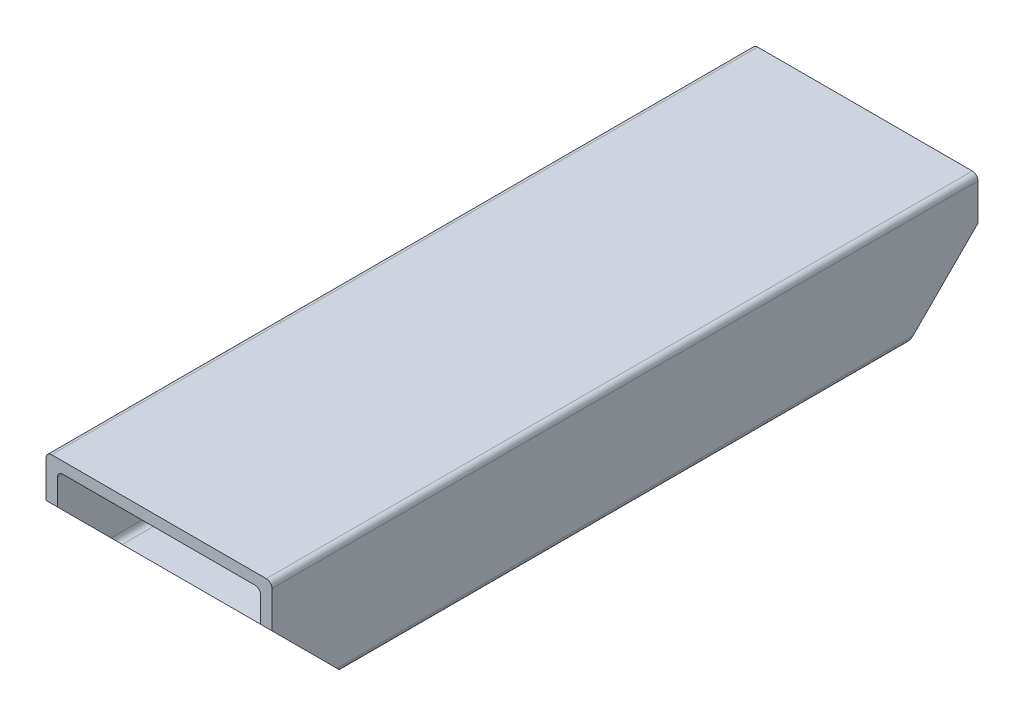
ISO-10303-21;
HEADER;
FILE_DESCRIPTION(('STEP AP214'),'2;1');
FILE_NAME('part.step','',(''),(''),'','','');
FILE_SCHEMA(('AUTOMOTIVE_DESIGN { 1 0 10303 214 1 1 1 1 }'));
ENDSEC;
DATA;
#1=APPLICATION_CONTEXT('core data for automotive mechanical design processes');
#2=APPLICATION_PROTOCOL_DEFINITION('international standard','automotive_design',2000,#1);
#3=PRODUCT_CONTEXT('',#1,'mechanical');
#4=PRODUCT('Part','Part','',(#3));
#5=PRODUCT_RELATED_PRODUCT_CATEGORY('part','',(#4));
#6=PRODUCT_DEFINITION_FORMATION('','',#4);
#7=PRODUCT_DEFINITION_CONTEXT('part definition',#1,'design');
#8=PRODUCT_DEFINITION('design','',#6,#7);
#9=PRODUCT_DEFINITION_SHAPE('','',#8);
#10=(LENGTH_UNIT() NAMED_UNIT(*) SI_UNIT(.MILLI.,.METRE.));
#11=(NAMED_UNIT(*) PLANE_ANGLE_UNIT() SI_UNIT($,.RADIAN.));
#12=(NAMED_UNIT(*) SI_UNIT($,.STERADIAN.) SOLID_ANGLE_UNIT());
#13=UNCERTAINTY_MEASURE_WITH_UNIT(LENGTH_MEASURE(1.E-05),#10,'distance_accuracy_value','');
#14=(GEOMETRIC_REPRESENTATION_CONTEXT(3) GLOBAL_UNCERTAINTY_ASSIGNED_CONTEXT((#13)) GLOBAL_UNIT_ASSIGNED_CONTEXT((#10,
#11,#12)) REPRESENTATION_CONTEXT('',''));
#15=CARTESIAN_POINT('',(0.,0.,0.));
#16=DIRECTION('',(0.,0.,1.));
#17=DIRECTION('',(1.,0.,0.));
#18=AXIS2_PLACEMENT_3D('',#15,#16,#17);
#19=CARTESIAN_POINT('',(2.,2.,250.));
#20=DIRECTION('',(0.,0.,-1.));
#21=DIRECTION('',(-1.,0.,0.));
#22=AXIS2_PLACEMENT_3D('',#19,#20,#21);
#23=PLANE('',#22);
#24=DIRECTION('',(0.,-1.,0.));
#25=VECTOR('',#24,1.);
#26=CARTESIAN_POINT('',(0.,2.00000000000001,250.));
#27=LINE('',#26,#25);
#28=CARTESIAN_POINT('',(0.,38.,250.));
#29=VERTEX_POINT('',#28);
#30=CARTESIAN_POINT('',(0.,25.,250.));
#31=VERTEX_POINT('',#30);
#32=EDGE_CURVE('E188',#29,#31,#27,.T.);
#33=ORIENTED_EDGE('',*,*,#32,.T.);
#34=DIRECTION('',(1.,0.,0.));
#35=VECTOR('',#34,1.);
#36=CARTESIAN_POINT('',(0.,25.,250.));
#37=LINE('',#36,#35);
#38=CARTESIAN_POINT('',(4.,25.,250.));
#39=VERTEX_POINT('',#38);
#40=EDGE_CURVE('E169',#31,#39,#37,.T.);
#41=ORIENTED_EDGE('',*,*,#40,.T.);
#42=DIRECTION('',(0.,-1.,0.));
#43=VECTOR('',#42,1.);
#44=CARTESIAN_POINT('',(4.,6.00000000000001,250.));
#45=LINE('',#44,#43);
#46=CARTESIAN_POINT('',(4.,34.,250.));
#47=VERTEX_POINT('',#46);
#48=EDGE_CURVE('E271',#47,#39,#45,.T.);
#49=ORIENTED_EDGE('',*,*,#48,.F.);
#50=CARTESIAN_POINT('',(6.,34.,250.));
#51=DIRECTION('',(0.,0.,1.));
#52=DIRECTION('',(1.,0.,0.));
#53=AXIS2_PLACEMENT_3D('',#50,#51,#52);
#54=CIRCLE('',#53,2.);
#55=CARTESIAN_POINT('',(6.00000000000001,36.,250.));
#56=VERTEX_POINT('',#55);
#57=EDGE_CURVE('E269',#56,#47,#54,.T.);
#58=ORIENTED_EDGE('',*,*,#57,.F.);
#59=DIRECTION('',(-1.,0.,0.));
#60=VECTOR('',#59,1.);
#61=CARTESIAN_POINT('',(6.00000000000001,36.,250.));
#62=LINE('',#61,#60);
#63=CARTESIAN_POINT('',(74.,36.,250.));
#64=VERTEX_POINT('',#63);
#65=EDGE_CURVE('E267',#64,#56,#62,.T.);
#66=ORIENTED_EDGE('',*,*,#65,.F.);
#67=CARTESIAN_POINT('',(74.,34.,250.));
#68=DIRECTION('',(0.,0.,1.));
#69=DIRECTION('',(1.,0.,0.));
#70=AXIS2_PLACEMENT_3D('',#67,#68,#69);
#71=CIRCLE('',#70,2.);
#72=CARTESIAN_POINT('',(76.,34.,250.));
#73=VERTEX_POINT('',#72);
#74=EDGE_CURVE('E264',#73,#64,#71,.T.);
#75=ORIENTED_EDGE('',*,*,#74,.F.);
#76=DIRECTION('',(0.,1.,0.));
#77=VECTOR('',#76,1.);
#78=CARTESIAN_POINT('',(76.,6.,250.));
#79=LINE('',#78,#77);
#80=CARTESIAN_POINT('',(76.,25.,250.));
#81=VERTEX_POINT('',#80);
#82=EDGE_CURVE('E262',#81,#73,#79,.T.);
#83=ORIENTED_EDGE('',*,*,#82,.F.);
#84=CARTESIAN_POINT('',(80.,25.,250.));
#85=VERTEX_POINT('',#84);
#86=EDGE_CURVE('E181',#81,#85,#37,.T.);
#87=ORIENTED_EDGE('',*,*,#86,.T.);
#88=DIRECTION('',(0.,1.,0.));
#89=VECTOR('',#88,1.);
#90=CARTESIAN_POINT('',(80.,2.,250.));
#91=LINE('',#90,#89);
#92=CARTESIAN_POINT('',(80.,38.,250.));
#93=VERTEX_POINT('',#92);
#94=EDGE_CURVE('E215',#85,#93,#91,.T.);
#95=ORIENTED_EDGE('',*,*,#94,.T.);
#96=CARTESIAN_POINT('',(78.,38.,250.));
#97=DIRECTION('',(0.,0.,1.));
#98=DIRECTION('',(-1.,0.,0.));
#99=AXIS2_PLACEMENT_3D('',#96,#97,#98);
#100=CIRCLE('',#99,2.);
#101=CARTESIAN_POINT('',(78.,40.,250.));
#102=VERTEX_POINT('',#101);
#103=EDGE_CURVE('E300',#93,#102,#100,.T.);
#104=ORIENTED_EDGE('',*,*,#103,.T.);
#105=DIRECTION('',(-1.,0.,0.));
#106=VECTOR('',#105,1.);
#107=CARTESIAN_POINT('',(2.00000000000001,40.,250.));
#108=LINE('',#107,#106);
#109=CARTESIAN_POINT('',(2.00000000000001,40.,250.));
#110=VERTEX_POINT('',#109);
#111=EDGE_CURVE('E200',#102,#110,#108,.T.);
#112=ORIENTED_EDGE('',*,*,#111,.T.);
#113=CARTESIAN_POINT('',(2.,38.,250.));
#114=DIRECTION('',(0.,0.,1.));
#115=DIRECTION('',(-1.,0.,0.));
#116=AXIS2_PLACEMENT_3D('',#113,#114,#115);
#117=CIRCLE('',#116,2.);
#118=EDGE_CURVE('E195',#110,#29,#117,.T.);
#119=ORIENTED_EDGE('',*,*,#118,.T.);
#120=EDGE_LOOP('',(#33,#41,#49,#58,#66,#75,#83,#87,#95,#104,#112,#119));
#121=FACE_BOUND('',#120,.T.);
#122=ADVANCED_FACE('F33',(#121),#23,.F.);
#123=CARTESIAN_POINT('',(2.,2.,0.));
#124=DIRECTION('',(0.,0.,-1.));
#125=DIRECTION('',(-1.,0.,0.));
#126=AXIS2_PLACEMENT_3D('',#123,#124,#125);
#127=PLANE('',#126);
#128=DIRECTION('',(1.,0.,0.));
#129=VECTOR('',#128,1.);
#130=CARTESIAN_POINT('',(0.,25.,0.));
#131=LINE('',#130,#129);
#132=CARTESIAN_POINT('',(0.,25.,0.));
#133=VERTEX_POINT('',#132);
#134=CARTESIAN_POINT('',(4.,25.,0.));
#135=VERTEX_POINT('',#134);
#136=EDGE_CURVE('E315',#133,#135,#131,.T.);
#137=ORIENTED_EDGE('',*,*,#136,.F.);
#138=DIRECTION('',(0.,-1.,0.));
#139=VECTOR('',#138,1.);
#140=CARTESIAN_POINT('',(0.,2.00000000000001,0.));
#141=LINE('',#140,#139);
#142=CARTESIAN_POINT('',(0.,38.,0.));
#143=VERTEX_POINT('',#142);
#144=EDGE_CURVE('E213',#143,#133,#141,.T.);
#145=ORIENTED_EDGE('',*,*,#144,.F.);
#146=CARTESIAN_POINT('',(2.,38.,0.));
#147=DIRECTION('',(0.,0.,1.));
#148=DIRECTION('',(-1.,0.,0.));
#149=AXIS2_PLACEMENT_3D('',#146,#147,#148);
#150=CIRCLE('',#149,2.);
#151=CARTESIAN_POINT('',(2.00000000000001,40.,0.));
#152=VERTEX_POINT('',#151);
#153=EDGE_CURVE('E211',#152,#143,#150,.T.);
#154=ORIENTED_EDGE('',*,*,#153,.F.);
#155=DIRECTION('',(-1.,0.,0.));
#156=VECTOR('',#155,1.);
#157=CARTESIAN_POINT('',(2.00000000000001,40.,0.));
#158=LINE('',#157,#156);
#159=CARTESIAN_POINT('',(78.,40.,0.));
#160=VERTEX_POINT('',#159);
#161=EDGE_CURVE('E209',#160,#152,#158,.T.);
#162=ORIENTED_EDGE('',*,*,#161,.F.);
#163=CARTESIAN_POINT('',(78.,38.,0.));
#164=DIRECTION('',(0.,0.,1.));
#165=DIRECTION('',(-1.,0.,0.));
#166=AXIS2_PLACEMENT_3D('',#163,#164,#165);
#167=CIRCLE('',#166,2.);
#168=CARTESIAN_POINT('',(80.,38.,0.));
#169=VERTEX_POINT('',#168);
#170=EDGE_CURVE('E206',#169,#160,#167,.T.);
#171=ORIENTED_EDGE('',*,*,#170,.F.);
#172=DIRECTION('',(0.,1.,0.));
#173=VECTOR('',#172,1.);
#174=CARTESIAN_POINT('',(80.,2.,0.));
#175=LINE('',#174,#173);
#176=CARTESIAN_POINT('',(80.,25.,0.));
#177=VERTEX_POINT('',#176);
#178=EDGE_CURVE('E204',#177,#169,#175,.T.);
#179=ORIENTED_EDGE('',*,*,#178,.F.);
#180=CARTESIAN_POINT('',(76.,25.,0.));
#181=VERTEX_POINT('',#180);
#182=EDGE_CURVE('E319',#181,#177,#131,.T.);
#183=ORIENTED_EDGE('',*,*,#182,.F.);
#184=DIRECTION('',(0.,1.,0.));
#185=VECTOR('',#184,1.);
#186=CARTESIAN_POINT('',(76.,6.,0.));
#187=LINE('',#186,#185);
#188=CARTESIAN_POINT('',(76.,34.,0.));
#189=VERTEX_POINT('',#188);
#190=EDGE_CURVE('E261',#181,#189,#187,.T.);
#191=ORIENTED_EDGE('',*,*,#190,.T.);
#192=CARTESIAN_POINT('',(74.,34.,0.));
#193=DIRECTION('',(0.,0.,1.));
#194=DIRECTION('',(1.,0.,0.));
#195=AXIS2_PLACEMENT_3D('',#192,#193,#194);
#196=CIRCLE('',#195,2.);
#197=CARTESIAN_POINT('',(74.,36.,0.));
#198=VERTEX_POINT('',#197);
#199=EDGE_CURVE('E274',#189,#198,#196,.T.);
#200=ORIENTED_EDGE('',*,*,#199,.T.);
#201=DIRECTION('',(-1.,0.,0.));
#202=VECTOR('',#201,1.);
#203=CARTESIAN_POINT('',(6.00000000000001,36.,0.));
#204=LINE('',#203,#202);
#205=CARTESIAN_POINT('',(6.00000000000001,36.,0.));
#206=VERTEX_POINT('',#205);
#207=EDGE_CURVE('E277',#198,#206,#204,.T.);
#208=ORIENTED_EDGE('',*,*,#207,.T.);
#209=CARTESIAN_POINT('',(6.,34.,0.));
#210=DIRECTION('',(0.,0.,1.));
#211=DIRECTION('',(1.,0.,0.));
#212=AXIS2_PLACEMENT_3D('',#209,#210,#211);
#213=CIRCLE('',#212,2.);
#214=CARTESIAN_POINT('',(4.,34.,0.));
#215=VERTEX_POINT('',#214);
#216=EDGE_CURVE('E280',#206,#215,#213,.T.);
#217=ORIENTED_EDGE('',*,*,#216,.T.);
#218=DIRECTION('',(0.,-1.,0.));
#219=VECTOR('',#218,1.);
#220=CARTESIAN_POINT('',(4.,6.00000000000001,0.));
#221=LINE('',#220,#219);
#222=EDGE_CURVE('E265',#215,#135,#221,.T.);
#223=ORIENTED_EDGE('',*,*,#222,.T.);
#224=EDGE_LOOP('',(#137,#145,#154,#162,#171,#179,#183,#191,#200,#208,#217,#223));
#225=FACE_BOUND('',#224,.T.);
#226=ADVANCED_FACE('F314',(#225),#127,.T.);
#227=CARTESIAN_POINT('',(2.,2.,250.));
#228=DIRECTION('',(0.,0.,-1.));
#229=DIRECTION('',(-1.,0.,0.));
#230=AXIS2_PLACEMENT_3D('',#227,#228,#229);
#231=CYLINDRICAL_SURFACE('',#230,2.);
#232=DIRECTION('',(0.,0.,-1.));
#233=VECTOR('',#232,1.);
#234=CARTESIAN_POINT('',(2.00000000000001,0.,250.));
#235=LINE('',#234,#233);
#236=CARTESIAN_POINT('',(2.00000000000001,0.,225.));
#237=VERTEX_POINT('',#236);
#238=CARTESIAN_POINT('',(2.00000000000001,0.,25.0000000000003));
#239=VERTEX_POINT('',#238);
#240=EDGE_CURVE('E231',#237,#239,#235,.T.);
#241=ORIENTED_EDGE('',*,*,#240,.F.);
#242=CARTESIAN_POINT('',(2.,2.,227.));
#243=DIRECTION('',(0.,0.707106781186551,-0.707106781186544));
#244=DIRECTION('',(0.,-0.707106781186544,-0.707106781186551));
#245=AXIS2_PLACEMENT_3D('',#242,#243,#244);
#246=ELLIPSE('',#245,2.82842712474621,2.);
#247=CARTESIAN_POINT('',(0.,2.00000000000002,227.));
#248=VERTEX_POINT('',#247);
#249=EDGE_CURVE('E328',#237,#248,#246,.T.);
#250=ORIENTED_EDGE('',*,*,#249,.T.);
#251=DIRECTION('',(0.,0.,-1.));
#252=VECTOR('',#251,1.);
#253=CARTESIAN_POINT('',(0.,2.00000000000001,250.));
#254=LINE('',#253,#252);
#255=CARTESIAN_POINT('',(0.,1.99999999999999,23.0000000000003));
#256=VERTEX_POINT('',#255);
#257=EDGE_CURVE('E190',#248,#256,#254,.T.);
#258=ORIENTED_EDGE('',*,*,#257,.T.);
#259=CARTESIAN_POINT('',(2.,2.,23.0000000000003));
#260=DIRECTION('',(0.,0.707106781186551,0.707106781186544));
#261=DIRECTION('',(0.,0.707106781186544,-0.707106781186551));
#262=AXIS2_PLACEMENT_3D('',#259,#260,#261);
#263=ELLIPSE('',#262,2.82842712474621,2.);
#264=EDGE_CURVE('E258',#256,#239,#263,.T.);
#265=ORIENTED_EDGE('',*,*,#264,.T.);
#266=EDGE_LOOP('',(#241,#250,#258,#265));
#267=FACE_BOUND('',#266,.T.);
#268=ADVANCED_FACE('F35',(#267),#231,.T.);
#269=CARTESIAN_POINT('',(2.00000000000001,0.,250.));
#270=DIRECTION('',(0.,1.,0.));
#271=DIRECTION('',(0.,0.,1.));
#272=AXIS2_PLACEMENT_3D('',#269,#270,#271);
#273=PLANE('',#272);
#274=DIRECTION('',(0.,0.,-1.));
#275=VECTOR('',#274,1.);
#276=CARTESIAN_POINT('',(78.,0.,250.));
#277=LINE('',#276,#275);
#278=CARTESIAN_POINT('',(78.,0.,225.));
#279=VERTEX_POINT('',#278);
#280=CARTESIAN_POINT('',(78.,0.,25.0000000000003));
#281=VERTEX_POINT('',#280);
#282=EDGE_CURVE('E229',#279,#281,#277,.T.);
#283=ORIENTED_EDGE('',*,*,#282,.F.);
#284=DIRECTION('',(1.,0.,0.));
#285=VECTOR('',#284,1.);
#286=CARTESIAN_POINT('',(0.,0.,225.));
#287=LINE('',#286,#285);
#288=EDGE_CURVE('E191',#237,#279,#287,.T.);
#289=ORIENTED_EDGE('',*,*,#288,.F.);
#290=ORIENTED_EDGE('',*,*,#240,.T.);
#291=DIRECTION('',(1.,0.,0.));
#292=VECTOR('',#291,1.);
#293=CARTESIAN_POINT('',(0.,0.,25.0000000000003));
#294=LINE('',#293,#292);
#295=EDGE_CURVE('E318',#239,#281,#294,.T.);
#296=ORIENTED_EDGE('',*,*,#295,.T.);
#297=EDGE_LOOP('',(#283,#289,#290,#296));
#298=FACE_BOUND('',#297,.T.);
#299=ADVANCED_FACE('F410',(#298),#273,.F.);
#300=CARTESIAN_POINT('',(78.,2.,250.));
#301=DIRECTION('',(0.,0.,-1.));
#302=DIRECTION('',(-1.,0.,0.));
#303=AXIS2_PLACEMENT_3D('',#300,#301,#302);
#304=CYLINDRICAL_SURFACE('',#303,2.);
#305=DIRECTION('',(0.,0.,-1.));
#306=VECTOR('',#305,1.);
#307=CARTESIAN_POINT('',(80.,2.,250.));
#308=LINE('',#307,#306);
#309=CARTESIAN_POINT('',(80.,2.00000000000001,227.));
#310=VERTEX_POINT('',#309);
#311=CARTESIAN_POINT('',(80.,1.99999999999999,23.0000000000003));
#312=VERTEX_POINT('',#311);
#313=EDGE_CURVE('E227',#310,#312,#308,.T.);
#314=ORIENTED_EDGE('',*,*,#313,.F.);
#315=CARTESIAN_POINT('',(78.,2.,227.));
#316=DIRECTION('',(0.,0.707106781186551,-0.707106781186544));
#317=DIRECTION('',(0.,-0.707106781186544,-0.707106781186551));
#318=AXIS2_PLACEMENT_3D('',#315,#316,#317);
#319=ELLIPSE('',#318,2.82842712474621,2.);
#320=EDGE_CURVE('E331',#310,#279,#319,.T.);
#321=ORIENTED_EDGE('',*,*,#320,.T.);
#322=ORIENTED_EDGE('',*,*,#282,.T.);
#323=CARTESIAN_POINT('',(78.,2.,23.0000000000003));
#324=DIRECTION('',(0.,0.707106781186551,0.707106781186544));
#325=DIRECTION('',(0.,0.707106781186544,-0.707106781186551));
#326=AXIS2_PLACEMENT_3D('',#323,#324,#325);
#327=ELLIPSE('',#326,2.82842712474621,2.);
#328=EDGE_CURVE('E251',#281,#312,#327,.T.);
#329=ORIENTED_EDGE('',*,*,#328,.T.);
#330=EDGE_LOOP('',(#314,#321,#322,#329));
#331=FACE_BOUND('',#330,.T.);
#332=ADVANCED_FACE('F408',(#331),#304,.T.);
#333=CARTESIAN_POINT('',(80.,2.,250.));
#334=DIRECTION('',(-1.,0.,0.));
#335=DIRECTION('',(0.,0.,1.));
#336=AXIS2_PLACEMENT_3D('',#333,#334,#335);
#337=PLANE('',#336);
#338=ORIENTED_EDGE('',*,*,#94,.F.);
#339=DIRECTION('',(0.,0.707106781186544,0.707106781186551));
#340=VECTOR('',#339,1.);
#341=CARTESIAN_POINT('',(80.,25.,250.));
#342=LINE('',#341,#340);
#343=EDGE_CURVE('E192',#310,#85,#342,.T.);
#344=ORIENTED_EDGE('',*,*,#343,.F.);
#345=ORIENTED_EDGE('',*,*,#313,.T.);
#346=DIRECTION('',(0.,-0.707106781186544,0.707106781186551));
#347=VECTOR('',#346,1.);
#348=CARTESIAN_POINT('',(80.,25.,0.));
#349=LINE('',#348,#347);
#350=EDGE_CURVE('E325',#177,#312,#349,.T.);
#351=ORIENTED_EDGE('',*,*,#350,.F.);
#352=ORIENTED_EDGE('',*,*,#178,.T.);
#353=DIRECTION('',(0.,0.,-1.));
#354=VECTOR('',#353,1.);
#355=CARTESIAN_POINT('',(80.,38.,250.));
#356=LINE('',#355,#354);
#357=EDGE_CURVE('E224',#93,#169,#356,.T.);
#358=ORIENTED_EDGE('',*,*,#357,.F.);
#359=EDGE_LOOP('',(#338,#344,#345,#351,#352,#358));
#360=FACE_BOUND('',#359,.T.);
#361=ADVANCED_FACE('F349',(#360),#337,.F.);
#362=CARTESIAN_POINT('',(78.,38.,250.));
#363=DIRECTION('',(0.,0.,-1.));
#364=DIRECTION('',(-1.,0.,0.));
#365=AXIS2_PLACEMENT_3D('',#362,#363,#364);
#366=CYLINDRICAL_SURFACE('',#365,2.);
#367=ORIENTED_EDGE('',*,*,#170,.T.);
#368=DIRECTION('',(0.,0.,-1.));
#369=VECTOR('',#368,1.);
#370=CARTESIAN_POINT('',(78.,40.,250.));
#371=LINE('',#370,#369);
#372=EDGE_CURVE('E221',#102,#160,#371,.T.);
#373=ORIENTED_EDGE('',*,*,#372,.F.);
#374=ORIENTED_EDGE('',*,*,#103,.F.);
#375=ORIENTED_EDGE('',*,*,#357,.T.);
#376=EDGE_LOOP('',(#367,#373,#374,#375));
#377=FACE_BOUND('',#376,.T.);
#378=ADVANCED_FACE('F354',(#377),#366,.T.);
#379=CARTESIAN_POINT('',(2.00000000000001,40.,250.));
#380=DIRECTION('',(0.,-1.,0.));
#381=DIRECTION('',(0.,0.,-1.));
#382=AXIS2_PLACEMENT_3D('',#379,#380,#381);
#383=PLANE('',#382);
#384=ORIENTED_EDGE('',*,*,#161,.T.);
#385=DIRECTION('',(0.,0.,-1.));
#386=VECTOR('',#385,1.);
#387=CARTESIAN_POINT('',(2.00000000000001,40.,250.));
#388=LINE('',#387,#386);
#389=EDGE_CURVE('E218',#110,#152,#388,.T.);
#390=ORIENTED_EDGE('',*,*,#389,.F.);
#391=ORIENTED_EDGE('',*,*,#111,.F.);
#392=ORIENTED_EDGE('',*,*,#372,.T.);
#393=EDGE_LOOP('',(#384,#390,#391,#392));
#394=FACE_BOUND('',#393,.T.);
#395=ADVANCED_FACE('F306',(#394),#383,.F.);
#396=CARTESIAN_POINT('',(2.,38.,250.));
#397=DIRECTION('',(0.,0.,-1.));
#398=DIRECTION('',(-1.,0.,0.));
#399=AXIS2_PLACEMENT_3D('',#396,#397,#398);
#400=CYLINDRICAL_SURFACE('',#399,2.);
#401=ORIENTED_EDGE('',*,*,#153,.T.);
#402=DIRECTION('',(0.,0.,-1.));
#403=VECTOR('',#402,1.);
#404=CARTESIAN_POINT('',(0.,38.,250.));
#405=LINE('',#404,#403);
#406=EDGE_CURVE('E198',#29,#143,#405,.T.);
#407=ORIENTED_EDGE('',*,*,#406,.F.);
#408=ORIENTED_EDGE('',*,*,#118,.F.);
#409=ORIENTED_EDGE('',*,*,#389,.T.);
#410=EDGE_LOOP('',(#401,#407,#408,#409));
#411=FACE_BOUND('',#410,.T.);
#412=ADVANCED_FACE('F310',(#411),#400,.T.);
#413=CARTESIAN_POINT('',(0.,2.00000000000001,250.));
#414=DIRECTION('',(1.,0.,0.));
#415=DIRECTION('',(0.,0.,-1.));
#416=AXIS2_PLACEMENT_3D('',#413,#414,#415);
#417=PLANE('',#416);
#418=ORIENTED_EDGE('',*,*,#257,.F.);
#419=DIRECTION('',(0.,0.707106781186544,0.707106781186551));
#420=VECTOR('',#419,1.);
#421=CARTESIAN_POINT('',(0.,25.,250.));
#422=LINE('',#421,#420);
#423=EDGE_CURVE('E172',#248,#31,#422,.T.);
#424=ORIENTED_EDGE('',*,*,#423,.T.);
#425=ORIENTED_EDGE('',*,*,#32,.F.);
#426=ORIENTED_EDGE('',*,*,#406,.T.);
#427=ORIENTED_EDGE('',*,*,#144,.T.);
#428=DIRECTION('',(0.,-0.707106781186544,0.707106781186551));
#429=VECTOR('',#428,1.);
#430=CARTESIAN_POINT('',(0.,25.,0.));
#431=LINE('',#430,#429);
#432=EDGE_CURVE('E323',#133,#256,#431,.T.);
#433=ORIENTED_EDGE('',*,*,#432,.T.);
#434=EDGE_LOOP('',(#418,#424,#425,#426,#427,#433));
#435=FACE_BOUND('',#434,.T.);
#436=ADVANCED_FACE('F186',(#435),#417,.F.);
#437=CARTESIAN_POINT('',(74.,6.,250.));
#438=DIRECTION('',(0.,0.,-1.));
#439=DIRECTION('',(-1.,0.,0.));
#440=AXIS2_PLACEMENT_3D('',#437,#438,#439);
#441=CYLINDRICAL_SURFACE('',#440,2.);
#442=CARTESIAN_POINT('',(74.,6.,231.));
#443=DIRECTION('',(0.,0.707106781186551,-0.707106781186544));
#444=DIRECTION('',(0.,-0.707106781186544,-0.707106781186551));
#445=AXIS2_PLACEMENT_3D('',#442,#443,#444);
#446=ELLIPSE('',#445,2.82842712474621,2.);
#447=CARTESIAN_POINT('',(76.,6.,231.));
#448=VERTEX_POINT('',#447);
#449=CARTESIAN_POINT('',(74.,4.,229.));
#450=VERTEX_POINT('',#449);
#451=EDGE_CURVE('E47',#448,#450,#446,.T.);
#452=ORIENTED_EDGE('',*,*,#451,.F.);
#453=DIRECTION('',(0.,0.,-1.));
#454=VECTOR('',#453,1.);
#455=CARTESIAN_POINT('',(76.,6.,250.));
#456=LINE('',#455,#454);
#457=CARTESIAN_POINT('',(76.,6.,19.0000000000002));
#458=VERTEX_POINT('',#457);
#459=EDGE_CURVE('E207',#448,#458,#456,.T.);
#460=ORIENTED_EDGE('',*,*,#459,.T.);
#461=CARTESIAN_POINT('',(74.,6.,19.0000000000002));
#462=DIRECTION('',(0.,0.707106781186551,0.707106781186544));
#463=DIRECTION('',(0.,0.707106781186544,-0.707106781186551));
#464=AXIS2_PLACEMENT_3D('',#461,#462,#463);
#465=ELLIPSE('',#464,2.82842712474621,2.);
#466=CARTESIAN_POINT('',(74.,4.,21.0000000000002));
#467=VERTEX_POINT('',#466);
#468=EDGE_CURVE('E238',#467,#458,#465,.T.);
#469=ORIENTED_EDGE('',*,*,#468,.F.);
#470=DIRECTION('',(0.,0.,-1.));
#471=VECTOR('',#470,1.);
#472=CARTESIAN_POINT('',(74.,4.,250.));
#473=LINE('',#472,#471);
#474=EDGE_CURVE('E246',#450,#467,#473,.T.);
#475=ORIENTED_EDGE('',*,*,#474,.F.);
#476=EDGE_LOOP('',(#452,#460,#469,#475));
#477=FACE_BOUND('',#476,.T.);
#478=ADVANCED_FACE('F245',(#477),#441,.F.);
#479=CARTESIAN_POINT('',(76.,6.,250.));
#480=DIRECTION('',(-1.,0.,0.));
#481=DIRECTION('',(0.,0.,1.));
#482=AXIS2_PLACEMENT_3D('',#479,#480,#481);
#483=PLANE('',#482);
#484=DIRECTION('',(0.,-0.707106781186544,-0.707106781186551));
#485=VECTOR('',#484,1.);
#486=CARTESIAN_POINT('',(76.,15.5000000000001,240.5));
#487=LINE('',#486,#485);
#488=EDGE_CURVE('E334',#81,#448,#487,.T.);
#489=ORIENTED_EDGE('',*,*,#488,.F.);
#490=ORIENTED_EDGE('',*,*,#82,.T.);
#491=DIRECTION('',(0.,0.,-1.));
#492=VECTOR('',#491,1.);
#493=CARTESIAN_POINT('',(76.,34.,250.));
#494=LINE('',#493,#492);
#495=EDGE_CURVE('E295',#73,#189,#494,.T.);
#496=ORIENTED_EDGE('',*,*,#495,.T.);
#497=ORIENTED_EDGE('',*,*,#190,.F.);
#498=DIRECTION('',(0.,0.707106781186544,-0.707106781186551));
#499=VECTOR('',#498,1.);
#500=CARTESIAN_POINT('',(76.,-109.5,134.500000000001));
#501=LINE('',#500,#499);
#502=EDGE_CURVE('E248',#458,#181,#501,.T.);
#503=ORIENTED_EDGE('',*,*,#502,.F.);
#504=ORIENTED_EDGE('',*,*,#459,.F.);
#505=EDGE_LOOP('',(#489,#490,#496,#497,#503,#504));
#506=FACE_BOUND('',#505,.T.);
#507=ADVANCED_FACE('F358',(#506),#483,.T.);
#508=CARTESIAN_POINT('',(74.,34.,250.));
#509=DIRECTION('',(0.,0.,-1.));
#510=DIRECTION('',(-1.,0.,0.));
#511=AXIS2_PLACEMENT_3D('',#508,#509,#510);
#512=CYLINDRICAL_SURFACE('',#511,2.);
#513=ORIENTED_EDGE('',*,*,#199,.F.);
#514=ORIENTED_EDGE('',*,*,#495,.F.);
#515=ORIENTED_EDGE('',*,*,#74,.T.);
#516=DIRECTION('',(0.,0.,-1.));
#517=VECTOR('',#516,1.);
#518=CARTESIAN_POINT('',(74.,36.,250.));
#519=LINE('',#518,#517);
#520=EDGE_CURVE('E293',#64,#198,#519,.T.);
#521=ORIENTED_EDGE('',*,*,#520,.T.);
#522=EDGE_LOOP('',(#513,#514,#515,#521));
#523=FACE_BOUND('',#522,.T.);
#524=ADVANCED_FACE('F362',(#523),#512,.F.);
#525=CARTESIAN_POINT('',(6.00000000000001,36.,250.));
#526=DIRECTION('',(0.,-1.,0.));
#527=DIRECTION('',(0.,0.,-1.));
#528=AXIS2_PLACEMENT_3D('',#525,#526,#527);
#529=PLANE('',#528);
#530=ORIENTED_EDGE('',*,*,#207,.F.);
#531=ORIENTED_EDGE('',*,*,#520,.F.);
#532=ORIENTED_EDGE('',*,*,#65,.T.);
#533=DIRECTION('',(0.,0.,-1.));
#534=VECTOR('',#533,1.);
#535=CARTESIAN_POINT('',(6.00000000000001,36.,250.));
#536=LINE('',#535,#534);
#537=EDGE_CURVE('E291',#56,#206,#536,.T.);
#538=ORIENTED_EDGE('',*,*,#537,.T.);
#539=EDGE_LOOP('',(#530,#531,#532,#538));
#540=FACE_BOUND('',#539,.T.);
#541=ADVANCED_FACE('F367',(#540),#529,.T.);
#542=CARTESIAN_POINT('',(6.,34.,250.));
#543=DIRECTION('',(0.,0.,-1.));
#544=DIRECTION('',(-1.,0.,0.));
#545=AXIS2_PLACEMENT_3D('',#542,#543,#544);
#546=CYLINDRICAL_SURFACE('',#545,2.);
#547=ORIENTED_EDGE('',*,*,#216,.F.);
#548=ORIENTED_EDGE('',*,*,#537,.F.);
#549=ORIENTED_EDGE('',*,*,#57,.T.);
#550=DIRECTION('',(0.,0.,-1.));
#551=VECTOR('',#550,1.);
#552=CARTESIAN_POINT('',(4.,34.,250.));
#553=LINE('',#552,#551);
#554=EDGE_CURVE('E289',#47,#215,#553,.T.);
#555=ORIENTED_EDGE('',*,*,#554,.T.);
#556=EDGE_LOOP('',(#547,#548,#549,#555));
#557=FACE_BOUND('',#556,.T.);
#558=ADVANCED_FACE('F372',(#557),#546,.F.);
#559=CARTESIAN_POINT('',(4.,6.00000000000001,250.));
#560=DIRECTION('',(1.,0.,0.));
#561=DIRECTION('',(0.,0.,-1.));
#562=AXIS2_PLACEMENT_3D('',#559,#560,#561);
#563=PLANE('',#562);
#564=DIRECTION('',(0.,0.707106781186544,0.707106781186551));
#565=VECTOR('',#564,1.);
#566=CARTESIAN_POINT('',(4.,15.5000000000001,240.5));
#567=LINE('',#566,#565);
#568=CARTESIAN_POINT('',(4.,6.00000000000001,231.));
#569=VERTEX_POINT('',#568);
#570=EDGE_CURVE('E175',#569,#39,#567,.T.);
#571=ORIENTED_EDGE('',*,*,#570,.F.);
#572=DIRECTION('',(0.,0.,-1.));
#573=VECTOR('',#572,1.);
#574=CARTESIAN_POINT('',(4.,6.00000000000001,250.));
#575=LINE('',#574,#573);
#576=CARTESIAN_POINT('',(4.,6.00000000000001,19.0000000000002));
#577=VERTEX_POINT('',#576);
#578=EDGE_CURVE('E287',#569,#577,#575,.T.);
#579=ORIENTED_EDGE('',*,*,#578,.T.);
#580=DIRECTION('',(0.,-0.707106781186544,0.707106781186551));
#581=VECTOR('',#580,1.);
#582=CARTESIAN_POINT('',(4.,-109.5,134.500000000001));
#583=LINE('',#582,#581);
#584=EDGE_CURVE('E249',#135,#577,#583,.T.);
#585=ORIENTED_EDGE('',*,*,#584,.F.);
#586=ORIENTED_EDGE('',*,*,#222,.F.);
#587=ORIENTED_EDGE('',*,*,#554,.F.);
#588=ORIENTED_EDGE('',*,*,#48,.T.);
#589=EDGE_LOOP('',(#571,#579,#585,#586,#587,#588));
#590=FACE_BOUND('',#589,.T.);
#591=ADVANCED_FACE('F375',(#590),#563,.T.);
#592=CARTESIAN_POINT('',(6.,6.,250.));
#593=DIRECTION('',(0.,0.,-1.));
#594=DIRECTION('',(-1.,0.,0.));
#595=AXIS2_PLACEMENT_3D('',#592,#593,#594);
#596=CYLINDRICAL_SURFACE('',#595,2.);
#597=CARTESIAN_POINT('',(6.,6.,231.));
#598=DIRECTION('',(0.,0.707106781186551,-0.707106781186544));
#599=DIRECTION('',(0.,-0.707106781186544,-0.707106781186551));
#600=AXIS2_PLACEMENT_3D('',#597,#598,#599);
#601=ELLIPSE('',#600,2.82842712474621,2.);
#602=CARTESIAN_POINT('',(6.00000000000001,4.,229.));
#603=VERTEX_POINT('',#602);
#604=EDGE_CURVE('E180',#603,#569,#601,.T.);
#605=ORIENTED_EDGE('',*,*,#604,.F.);
#606=DIRECTION('',(0.,0.,-1.));
#607=VECTOR('',#606,1.);
#608=CARTESIAN_POINT('',(6.00000000000001,4.,250.));
#609=LINE('',#608,#607);
#610=CARTESIAN_POINT('',(6.00000000000001,4.,21.0000000000002));
#611=VERTEX_POINT('',#610);
#612=EDGE_CURVE('E55',#603,#611,#609,.T.);
#613=ORIENTED_EDGE('',*,*,#612,.T.);
#614=CARTESIAN_POINT('',(6.,6.,19.0000000000002));
#615=DIRECTION('',(0.,0.707106781186551,0.707106781186544));
#616=DIRECTION('',(0.,0.707106781186544,-0.707106781186551));
#617=AXIS2_PLACEMENT_3D('',#614,#615,#616);
#618=ELLIPSE('',#617,2.82842712474621,2.);
#619=EDGE_CURVE('E241',#577,#611,#618,.T.);
#620=ORIENTED_EDGE('',*,*,#619,.F.);
#621=ORIENTED_EDGE('',*,*,#578,.F.);
#622=EDGE_LOOP('',(#605,#613,#620,#621));
#623=FACE_BOUND('',#622,.T.);
#624=ADVANCED_FACE('F377',(#623),#596,.F.);
#625=CARTESIAN_POINT('',(6.00000000000001,4.,250.));
#626=DIRECTION('',(0.,1.,0.));
#627=DIRECTION('',(0.,0.,1.));
#628=AXIS2_PLACEMENT_3D('',#625,#626,#627);
#629=PLANE('',#628);
#630=DIRECTION('',(-1.,0.,0.));
#631=VECTOR('',#630,1.);
#632=CARTESIAN_POINT('',(6.00000000000001,4.,229.));
#633=LINE('',#632,#631);
#634=EDGE_CURVE('E11',#450,#603,#633,.T.);
#635=ORIENTED_EDGE('',*,*,#634,.F.);
#636=ORIENTED_EDGE('',*,*,#474,.T.);
#637=DIRECTION('',(1.,0.,0.));
#638=VECTOR('',#637,1.);
#639=CARTESIAN_POINT('',(6.00000000000001,4.,21.0000000000002));
#640=LINE('',#639,#638);
#641=EDGE_CURVE('E41',#611,#467,#640,.T.);
#642=ORIENTED_EDGE('',*,*,#641,.F.);
#643=ORIENTED_EDGE('',*,*,#612,.F.);
#644=EDGE_LOOP('',(#635,#636,#642,#643));
#645=FACE_BOUND('',#644,.T.);
#646=ADVANCED_FACE('F378',(#645),#629,.T.);
#647=CARTESIAN_POINT('',(0.,25.,0.));
#648=DIRECTION('',(0.,0.707106781186551,0.707106781186544));
#649=DIRECTION('',(0.,-0.707106781186544,0.707106781186551));
#650=AXIS2_PLACEMENT_3D('',#647,#648,#649);
#651=PLANE('',#650);
#652=ORIENTED_EDGE('',*,*,#432,.F.);
#653=ORIENTED_EDGE('',*,*,#136,.T.);
#654=ORIENTED_EDGE('',*,*,#584,.T.);
#655=ORIENTED_EDGE('',*,*,#619,.T.);
#656=ORIENTED_EDGE('',*,*,#641,.T.);
#657=ORIENTED_EDGE('',*,*,#468,.T.);
#658=ORIENTED_EDGE('',*,*,#502,.T.);
#659=ORIENTED_EDGE('',*,*,#182,.T.);
#660=ORIENTED_EDGE('',*,*,#350,.T.);
#661=ORIENTED_EDGE('',*,*,#328,.F.);
#662=ORIENTED_EDGE('',*,*,#295,.F.);
#663=ORIENTED_EDGE('',*,*,#264,.F.);
#664=EDGE_LOOP('',(#652,#653,#654,#655,#656,#657,#658,#659,#660,#661,#662,#663));
#665=FACE_BOUND('',#664,.T.);
#666=ADVANCED_FACE('F237',(#665),#651,.F.);
#667=CARTESIAN_POINT('',(0.,25.,250.));
#668=DIRECTION('',(0.,0.707106781186551,-0.707106781186544));
#669=DIRECTION('',(0.,0.707106781186544,0.707106781186551));
#670=AXIS2_PLACEMENT_3D('',#667,#668,#669);
#671=PLANE('',#670);
#672=ORIENTED_EDGE('',*,*,#288,.T.);
#673=ORIENTED_EDGE('',*,*,#320,.F.);
#674=ORIENTED_EDGE('',*,*,#343,.T.);
#675=ORIENTED_EDGE('',*,*,#86,.F.);
#676=ORIENTED_EDGE('',*,*,#488,.T.);
#677=ORIENTED_EDGE('',*,*,#451,.T.);
#678=ORIENTED_EDGE('',*,*,#634,.T.);
#679=ORIENTED_EDGE('',*,*,#604,.T.);
#680=ORIENTED_EDGE('',*,*,#570,.T.);
#681=ORIENTED_EDGE('',*,*,#40,.F.);
#682=ORIENTED_EDGE('',*,*,#423,.F.);
#683=ORIENTED_EDGE('',*,*,#249,.F.);
#684=EDGE_LOOP('',(#672,#673,#674,#675,#676,#677,#678,#679,#680,#681,#682,#683));
#685=FACE_BOUND('',#684,.T.);
#686=ADVANCED_FACE('F171',(#685),#671,.F.);
#687=CLOSED_SHELL('',(#122,#226,#268,#299,#332,#361,#378,#395,#412,#436,#478,#507,#524,#541,
#558,#591,#624,#646,#666,#686));
#688=MANIFOLD_SOLID_BREP('B2',#687);
#689=ADVANCED_BREP_SHAPE_REPRESENTATION('',(#18,#688),#14);
#690=SHAPE_DEFINITION_REPRESENTATION(#9,#689);
ENDSEC;
END-ISO-10303-21;
